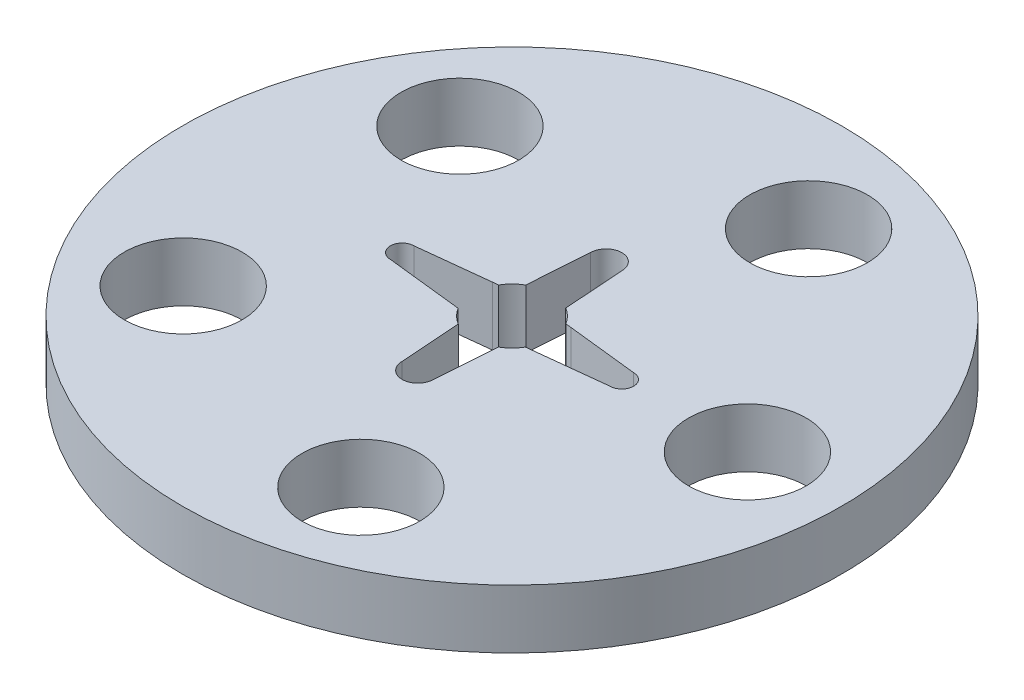
ISO-10303-21;
HEADER;
FILE_DESCRIPTION(('STEP AP214'),'2;1');
FILE_NAME('part.step','',(''),(''),'','','');
FILE_SCHEMA(('AUTOMOTIVE_DESIGN { 1 0 10303 214 1 1 1 1 }'));
ENDSEC;
DATA;
#1=APPLICATION_CONTEXT('core data for automotive mechanical design processes');
#2=APPLICATION_PROTOCOL_DEFINITION('international standard','automotive_design',2000,#1);
#3=PRODUCT_CONTEXT('',#1,'mechanical');
#4=PRODUCT('Part','Part','',(#3));
#5=PRODUCT_RELATED_PRODUCT_CATEGORY('part','',(#4));
#6=PRODUCT_DEFINITION_FORMATION('','',#4);
#7=PRODUCT_DEFINITION_CONTEXT('part definition',#1,'design');
#8=PRODUCT_DEFINITION('design','',#6,#7);
#9=PRODUCT_DEFINITION_SHAPE('','',#8);
#10=(LENGTH_UNIT() NAMED_UNIT(*) SI_UNIT(.MILLI.,.METRE.));
#11=(NAMED_UNIT(*) PLANE_ANGLE_UNIT() SI_UNIT($,.RADIAN.));
#12=(NAMED_UNIT(*) SI_UNIT($,.STERADIAN.) SOLID_ANGLE_UNIT());
#13=UNCERTAINTY_MEASURE_WITH_UNIT(LENGTH_MEASURE(1.E-05),#10,'distance_accuracy_value','');
#14=(GEOMETRIC_REPRESENTATION_CONTEXT(3) GLOBAL_UNCERTAINTY_ASSIGNED_CONTEXT((#13)) GLOBAL_UNIT_ASSIGNED_CONTEXT((#10,
#11,#12)) REPRESENTATION_CONTEXT('',''));
#15=CARTESIAN_POINT('',(0.,0.,0.));
#16=DIRECTION('',(0.,0.,1.));
#17=DIRECTION('',(1.,0.,0.));
#18=AXIS2_PLACEMENT_3D('',#15,#16,#17);
#19=CARTESIAN_POINT('',(0.,7.5,0.));
#20=DIRECTION('',(0.,1.,0.));
#21=DIRECTION('',(0.,0.,1.));
#22=AXIS2_PLACEMENT_3D('',#19,#20,#21);
#23=PLANE('',#22);
#24=CARTESIAN_POINT('',(-24.2705098312485,7.5,-17.6335575687741));
#25=DIRECTION('',(0.,1.,0.));
#26=DIRECTION('',(0.,0.,1.));
#27=AXIS2_PLACEMENT_3D('',#24,#25,#26);
#28=CIRCLE('',#27,7.5);
#29=CARTESIAN_POINT('',(-24.2705098312485,7.5,-10.1335575687741));
#30=VERTEX_POINT('',#29);
#31=EDGE_CURVE('E352',#30,#30,#28,.T.);
#32=ORIENTED_EDGE('',*,*,#31,.F.);
#33=EDGE_LOOP('',(#32));
#34=FACE_BOUND('',#33,.T.);
#35=CARTESIAN_POINT('',(9.27050983124848,7.5,28.5316954888547));
#36=DIRECTION('',(0.,1.,0.));
#37=DIRECTION('',(0.,0.,1.));
#38=AXIS2_PLACEMENT_3D('',#35,#36,#37);
#39=CIRCLE('',#38,7.5);
#40=CARTESIAN_POINT('',(9.27050983124848,7.5,36.0316954888547));
#41=VERTEX_POINT('',#40);
#42=EDGE_CURVE('E364',#41,#41,#39,.T.);
#43=ORIENTED_EDGE('',*,*,#42,.F.);
#44=EDGE_LOOP('',(#43));
#45=FACE_BOUND('',#44,.T.);
#46=CARTESIAN_POINT('',(0.,7.5,0.));
#47=DIRECTION('',(0.,1.,0.));
#48=DIRECTION('',(0.,0.,1.));
#49=AXIS2_PLACEMENT_3D('',#46,#47,#48);
#50=CIRCLE('',#49,42.);
#51=CARTESIAN_POINT('',(0.,7.5,42.));
#52=VERTEX_POINT('',#51);
#53=EDGE_CURVE('E11',#52,#52,#50,.T.);
#54=ORIENTED_EDGE('',*,*,#53,.T.);
#55=EDGE_LOOP('',(#54));
#56=FACE_BOUND('',#55,.T.);
#57=CARTESIAN_POINT('',(30.,7.5,0.));
#58=DIRECTION('',(0.,1.,0.));
#59=DIRECTION('',(0.,0.,1.));
#60=AXIS2_PLACEMENT_3D('',#57,#58,#59);
#61=CIRCLE('',#60,7.5);
#62=CARTESIAN_POINT('',(30.,7.5,7.5));
#63=VERTEX_POINT('',#62);
#64=EDGE_CURVE('E370',#63,#63,#61,.T.);
#65=ORIENTED_EDGE('',*,*,#64,.F.);
#66=EDGE_LOOP('',(#65));
#67=FACE_BOUND('',#66,.T.);
#68=CARTESIAN_POINT('',(-24.2705098312484,7.5,17.6335575687743));
#69=DIRECTION('',(0.,1.,0.));
#70=DIRECTION('',(0.,0.,1.));
#71=AXIS2_PLACEMENT_3D('',#68,#69,#70);
#72=CIRCLE('',#71,7.5);
#73=CARTESIAN_POINT('',(-24.2705098312484,7.5,25.1335575687743));
#74=VERTEX_POINT('',#73);
#75=EDGE_CURVE('E358',#74,#74,#72,.T.);
#76=ORIENTED_EDGE('',*,*,#75,.F.);
#77=EDGE_LOOP('',(#76));
#78=FACE_BOUND('',#77,.T.);
#79=CARTESIAN_POINT('',(9.27050983124836,7.5,-28.5316954888546));
#80=DIRECTION('',(0.,1.,0.));
#81=DIRECTION('',(0.,0.,1.));
#82=AXIS2_PLACEMENT_3D('',#79,#80,#81);
#83=CIRCLE('',#82,7.5);
#84=CARTESIAN_POINT('',(9.27050983124836,7.5,-21.0316954888546));
#85=VERTEX_POINT('',#84);
#86=EDGE_CURVE('E346',#85,#85,#83,.T.);
#87=ORIENTED_EDGE('',*,*,#86,.F.);
#88=EDGE_LOOP('',(#87));
#89=FACE_BOUND('',#88,.T.);
#90=DIRECTION('',(0.0708965575536933,0.,-0.997483673113017));
#91=VECTOR('',#90,1.);
#92=CARTESIAN_POINT('',(2.,7.5,12.));
#93=LINE('',#92,#91);
#94=CARTESIAN_POINT('',(2.,7.5,12.));
#95=VERTEX_POINT('',#94);
#96=CARTESIAN_POINT('',(2.49752798628677,7.5,4.99999802018599));
#97=VERTEX_POINT('',#96);
#98=EDGE_CURVE('E190',#95,#97,#93,.T.);
#99=ORIENTED_EDGE('',*,*,#98,.F.);
#100=CARTESIAN_POINT('',(0.,7.5,12.));
#101=DIRECTION('',(0.,1.,0.));
#102=DIRECTION('',(0.,0.,-1.));
#103=AXIS2_PLACEMENT_3D('',#100,#101,#102);
#104=CIRCLE('',#103,2.);
#105=CARTESIAN_POINT('',(-2.,7.5,12.));
#106=VERTEX_POINT('',#105);
#107=EDGE_CURVE('E182',#106,#95,#104,.T.);
#108=ORIENTED_EDGE('',*,*,#107,.F.);
#109=DIRECTION('',(0.0708190445228668,0.,0.997489179356282));
#110=VECTOR('',#109,1.);
#111=CARTESIAN_POINT('',(-2.49698128273283,7.5,4.99999802018599));
#112=LINE('',#111,#110);
#113=CARTESIAN_POINT('',(-2.54649480640618,7.5,4.30259798565124));
#114=VERTEX_POINT('',#113);
#115=EDGE_CURVE('E243',#114,#106,#112,.T.);
#116=ORIENTED_EDGE('',*,*,#115,.F.);
#117=CARTESIAN_POINT('',(0.,7.5,0.));
#118=DIRECTION('',(0.,1.,0.));
#119=DIRECTION('',(0.,0.,1.));
#120=AXIS2_PLACEMENT_3D('',#117,#118,#119);
#121=CIRCLE('',#120,4.99969851342896);
#122=CARTESIAN_POINT('',(-4.28517241592771,7.5,2.57571011392121));
#123=VERTEX_POINT('',#122);
#124=EDGE_CURVE('E241',#123,#114,#121,.T.);
#125=ORIENTED_EDGE('',*,*,#124,.F.);
#126=DIRECTION('',(0.99402586608719,0.,0.109144755025657));
#127=VECTOR('',#126,1.);
#128=CARTESIAN_POINT('',(-4.99969851342896,7.5,2.4972546345098));
#129=LINE('',#128,#127);
#130=CARTESIAN_POINT('',(-4.99969851342896,7.5,2.4972546345098));
#131=VERTEX_POINT('',#130);
#132=EDGE_CURVE('E239',#131,#123,#129,.T.);
#133=ORIENTED_EDGE('',*,*,#132,.F.);
#134=DIRECTION('',(0.993917369771732,0.,0.110128389010475));
#135=VECTOR('',#134,1.);
#136=CARTESIAN_POINT('',(-14.,7.5,1.5));
#137=LINE('',#136,#135);
#138=CARTESIAN_POINT('',(-14.,7.5,1.5));
#139=VERTEX_POINT('',#138);
#140=EDGE_CURVE('E237',#139,#131,#137,.T.);
#141=ORIENTED_EDGE('',*,*,#140,.F.);
#142=CARTESIAN_POINT('',(-14.,7.5,0.));
#143=DIRECTION('',(0.,1.,0.));
#144=DIRECTION('',(0.,0.,1.));
#145=AXIS2_PLACEMENT_3D('',#142,#143,#144);
#146=CIRCLE('',#145,1.5);
#147=CARTESIAN_POINT('',(-14.,7.5,-1.5));
#148=VERTEX_POINT('',#147);
#149=EDGE_CURVE('E235',#148,#139,#146,.T.);
#150=ORIENTED_EDGE('',*,*,#149,.F.);
#151=DIRECTION('',(-0.993917369771732,0.,0.110128389010475));
#152=VECTOR('',#151,1.);
#153=CARTESIAN_POINT('',(-14.,7.5,-1.5));
#154=LINE('',#153,#152);
#155=CARTESIAN_POINT('',(-4.99969851342896,7.5,-2.4972546345098));
#156=VERTEX_POINT('',#155);
#157=EDGE_CURVE('E233',#156,#148,#154,.T.);
#158=ORIENTED_EDGE('',*,*,#157,.F.);
#159=DIRECTION('',(-0.99402586608719,0.,0.109144755025657));
#160=VECTOR('',#159,1.);
#161=CARTESIAN_POINT('',(-4.99969851342896,7.5,-2.4972546345098));
#162=LINE('',#161,#160);
#163=CARTESIAN_POINT('',(-4.28517241592771,7.5,-2.57571011392121));
#164=VERTEX_POINT('',#163);
#165=EDGE_CURVE('E231',#164,#156,#162,.T.);
#166=ORIENTED_EDGE('',*,*,#165,.F.);
#167=CARTESIAN_POINT('',(0.,7.5,0.));
#168=DIRECTION('',(0.,1.,0.));
#169=DIRECTION('',(0.,0.,1.));
#170=AXIS2_PLACEMENT_3D('',#167,#168,#169);
#171=CIRCLE('',#170,4.99969851342896);
#172=CARTESIAN_POINT('',(-2.54649480640618,7.5,-4.30259798565124));
#173=VERTEX_POINT('',#172);
#174=EDGE_CURVE('E229',#173,#164,#171,.T.);
#175=ORIENTED_EDGE('',*,*,#174,.F.);
#176=DIRECTION('',(-0.0708190445228667,0.,0.997489179356282));
#177=VECTOR('',#176,1.);
#178=CARTESIAN_POINT('',(-2.,7.5,-12.));
#179=LINE('',#178,#177);
#180=CARTESIAN_POINT('',(-2.,7.5,-12.));
#181=VERTEX_POINT('',#180);
#182=EDGE_CURVE('E227',#181,#173,#179,.T.);
#183=ORIENTED_EDGE('',*,*,#182,.F.);
#184=CARTESIAN_POINT('',(0.,7.5,-12.));
#185=DIRECTION('',(0.,1.,0.));
#186=DIRECTION('',(0.,0.,1.));
#187=AXIS2_PLACEMENT_3D('',#184,#185,#186);
#188=CIRCLE('',#187,2.);
#189=CARTESIAN_POINT('',(2.,7.5,-12.));
#190=VERTEX_POINT('',#189);
#191=EDGE_CURVE('E225',#190,#181,#188,.T.);
#192=ORIENTED_EDGE('',*,*,#191,.F.);
#193=DIRECTION('',(-0.0708965575536933,0.,-0.997483673113017));
#194=VECTOR('',#193,1.);
#195=CARTESIAN_POINT('',(2.,7.5,-12.));
#196=LINE('',#195,#194);
#197=CARTESIAN_POINT('',(2.49752798628677,7.5,-4.99999802018599));
#198=VERTEX_POINT('',#197);
#199=EDGE_CURVE('E223',#198,#190,#196,.T.);
#200=ORIENTED_EDGE('',*,*,#199,.F.);
#201=DIRECTION('',(-0.0701953019469326,0.,-0.997533267407448));
#202=VECTOR('',#201,1.);
#203=CARTESIAN_POINT('',(2.49752798628677,7.5,-4.99999802018599));
#204=LINE('',#203,#202);
#205=CARTESIAN_POINT('',(2.54660796060753,7.5,-4.30253101327046));
#206=VERTEX_POINT('',#205);
#207=EDGE_CURVE('E221',#206,#198,#204,.T.);
#208=ORIENTED_EDGE('',*,*,#207,.F.);
#209=CARTESIAN_POINT('',(0.,7.5,0.));
#210=DIRECTION('',(0.,1.,0.));
#211=DIRECTION('',(0.,0.,1.));
#212=AXIS2_PLACEMENT_3D('',#209,#210,#211);
#213=CIRCLE('',#212,4.99969851342896);
#214=CARTESIAN_POINT('',(4.28517241592771,7.5,-2.57571011392121));
#215=VERTEX_POINT('',#214);
#216=EDGE_CURVE('E219',#215,#206,#213,.T.);
#217=ORIENTED_EDGE('',*,*,#216,.F.);
#218=DIRECTION('',(-0.99402586608719,0.,-0.109144755025657));
#219=VECTOR('',#218,1.);
#220=CARTESIAN_POINT('',(4.99969851342896,7.5,-2.4972546345098));
#221=LINE('',#220,#219);
#222=CARTESIAN_POINT('',(4.99969851342896,7.5,-2.4972546345098));
#223=VERTEX_POINT('',#222);
#224=EDGE_CURVE('E217',#223,#215,#221,.T.);
#225=ORIENTED_EDGE('',*,*,#224,.F.);
#226=DIRECTION('',(-0.993917369771732,0.,-0.110128389010475));
#227=VECTOR('',#226,1.);
#228=CARTESIAN_POINT('',(14.,7.5,-1.5));
#229=LINE('',#228,#227);
#230=CARTESIAN_POINT('',(14.,7.5,-1.5));
#231=VERTEX_POINT('',#230);
#232=EDGE_CURVE('E215',#231,#223,#229,.T.);
#233=ORIENTED_EDGE('',*,*,#232,.F.);
#234=CARTESIAN_POINT('',(14.,7.5,0.));
#235=DIRECTION('',(0.,1.,0.));
#236=DIRECTION('',(0.,0.,-1.));
#237=AXIS2_PLACEMENT_3D('',#234,#235,#236);
#238=CIRCLE('',#237,1.5);
#239=CARTESIAN_POINT('',(14.,7.5,1.5));
#240=VERTEX_POINT('',#239);
#241=EDGE_CURVE('E213',#240,#231,#238,.T.);
#242=ORIENTED_EDGE('',*,*,#241,.F.);
#243=DIRECTION('',(0.993917369771732,0.,-0.110128389010475));
#244=VECTOR('',#243,1.);
#245=CARTESIAN_POINT('',(14.,7.5,1.5));
#246=LINE('',#245,#244);
#247=CARTESIAN_POINT('',(4.99969851342896,7.5,2.4972546345098));
#248=VERTEX_POINT('',#247);
#249=EDGE_CURVE('E211',#248,#240,#246,.T.);
#250=ORIENTED_EDGE('',*,*,#249,.F.);
#251=DIRECTION('',(0.99402586608719,0.,-0.109144755025657));
#252=VECTOR('',#251,1.);
#253=CARTESIAN_POINT('',(4.99969851342896,7.5,2.4972546345098));
#254=LINE('',#253,#252);
#255=CARTESIAN_POINT('',(4.28517241592771,7.5,2.57571011392121));
#256=VERTEX_POINT('',#255);
#257=EDGE_CURVE('E209',#256,#248,#254,.T.);
#258=ORIENTED_EDGE('',*,*,#257,.F.);
#259=CARTESIAN_POINT('',(0.,7.5,0.));
#260=DIRECTION('',(0.,1.,0.));
#261=DIRECTION('',(0.,0.,1.));
#262=AXIS2_PLACEMENT_3D('',#259,#260,#261);
#263=CIRCLE('',#262,4.99969851342896);
#264=CARTESIAN_POINT('',(2.54660796060753,7.5,4.30253101327046));
#265=VERTEX_POINT('',#264);
#266=EDGE_CURVE('E205',#265,#256,#263,.T.);
#267=ORIENTED_EDGE('',*,*,#266,.F.);
#268=DIRECTION('',(0.0701953019469326,0.,-0.997533267407448));
#269=VECTOR('',#268,1.);
#270=CARTESIAN_POINT('',(2.49752798628677,7.5,4.99999802018599));
#271=LINE('',#270,#269);
#272=EDGE_CURVE('E203',#97,#265,#271,.T.);
#273=ORIENTED_EDGE('',*,*,#272,.F.);
#274=EDGE_LOOP('',(#99,#108,#116,#125,#133,#141,#150,#158,#166,#175,#183,#192,#200,#208,#217,
#225,#233,#242,#250,#258,#267,#273));
#275=FACE_BOUND('',#274,.T.);
#276=ADVANCED_FACE('F33',(#34,#45,#56,#67,#78,#89,#275),#23,.T.);
#277=CARTESIAN_POINT('',(0.,0.,0.));
#278=DIRECTION('',(0.,1.,0.));
#279=DIRECTION('',(0.,0.,1.));
#280=AXIS2_PLACEMENT_3D('',#277,#278,#279);
#281=PLANE('',#280);
#282=CARTESIAN_POINT('',(9.27050983124836,0.,-28.5316954888546));
#283=DIRECTION('',(0.,1.,0.));
#284=DIRECTION('',(0.,0.,1.));
#285=AXIS2_PLACEMENT_3D('',#282,#283,#284);
#286=CIRCLE('',#285,7.5);
#287=CARTESIAN_POINT('',(9.27050983124836,0.,-21.0316954888546));
#288=VERTEX_POINT('',#287);
#289=EDGE_CURVE('E198',#288,#288,#286,.T.);
#290=ORIENTED_EDGE('',*,*,#289,.T.);
#291=EDGE_LOOP('',(#290));
#292=FACE_BOUND('',#291,.T.);
#293=CARTESIAN_POINT('',(-24.2705098312485,0.,-17.6335575687741));
#294=DIRECTION('',(0.,1.,0.));
#295=DIRECTION('',(0.,0.,1.));
#296=AXIS2_PLACEMENT_3D('',#293,#294,#295);
#297=CIRCLE('',#296,7.5);
#298=CARTESIAN_POINT('',(-24.2705098312485,0.,-10.1335575687741));
#299=VERTEX_POINT('',#298);
#300=EDGE_CURVE('E349',#299,#299,#297,.T.);
#301=ORIENTED_EDGE('',*,*,#300,.T.);
#302=EDGE_LOOP('',(#301));
#303=FACE_BOUND('',#302,.T.);
#304=CARTESIAN_POINT('',(-24.2705098312484,0.,17.6335575687743));
#305=DIRECTION('',(0.,1.,0.));
#306=DIRECTION('',(0.,0.,1.));
#307=AXIS2_PLACEMENT_3D('',#304,#305,#306);
#308=CIRCLE('',#307,7.5);
#309=CARTESIAN_POINT('',(-24.2705098312484,0.,25.1335575687743));
#310=VERTEX_POINT('',#309);
#311=EDGE_CURVE('E355',#310,#310,#308,.T.);
#312=ORIENTED_EDGE('',*,*,#311,.T.);
#313=EDGE_LOOP('',(#312));
#314=FACE_BOUND('',#313,.T.);
#315=CARTESIAN_POINT('',(9.27050983124848,0.,28.5316954888547));
#316=DIRECTION('',(0.,1.,0.));
#317=DIRECTION('',(0.,0.,1.));
#318=AXIS2_PLACEMENT_3D('',#315,#316,#317);
#319=CIRCLE('',#318,7.5);
#320=CARTESIAN_POINT('',(9.27050983124848,0.,36.0316954888547));
#321=VERTEX_POINT('',#320);
#322=EDGE_CURVE('E361',#321,#321,#319,.T.);
#323=ORIENTED_EDGE('',*,*,#322,.T.);
#324=EDGE_LOOP('',(#323));
#325=FACE_BOUND('',#324,.T.);
#326=CARTESIAN_POINT('',(30.,0.,0.));
#327=DIRECTION('',(0.,1.,0.));
#328=DIRECTION('',(0.,0.,1.));
#329=AXIS2_PLACEMENT_3D('',#326,#327,#328);
#330=CIRCLE('',#329,7.5);
#331=CARTESIAN_POINT('',(30.,0.,7.5));
#332=VERTEX_POINT('',#331);
#333=EDGE_CURVE('E367',#332,#332,#330,.T.);
#334=ORIENTED_EDGE('',*,*,#333,.T.);
#335=EDGE_LOOP('',(#334));
#336=FACE_BOUND('',#335,.T.);
#337=CARTESIAN_POINT('',(0.,0.,0.));
#338=DIRECTION('',(0.,1.,0.));
#339=DIRECTION('',(0.,0.,1.));
#340=AXIS2_PLACEMENT_3D('',#337,#338,#339);
#341=CIRCLE('',#340,42.);
#342=CARTESIAN_POINT('',(0.,0.,42.));
#343=VERTEX_POINT('',#342);
#344=EDGE_CURVE('E37',#343,#343,#341,.T.);
#345=ORIENTED_EDGE('',*,*,#344,.F.);
#346=EDGE_LOOP('',(#345));
#347=FACE_BOUND('',#346,.T.);
#348=CARTESIAN_POINT('',(0.,0.,12.));
#349=DIRECTION('',(0.,1.,0.));
#350=DIRECTION('',(0.,0.,-1.));
#351=AXIS2_PLACEMENT_3D('',#348,#349,#350);
#352=CIRCLE('',#351,2.);
#353=CARTESIAN_POINT('',(-2.,0.,12.));
#354=VERTEX_POINT('',#353);
#355=CARTESIAN_POINT('',(2.,0.,12.));
#356=VERTEX_POINT('',#355);
#357=EDGE_CURVE('E56',#354,#356,#352,.T.);
#358=ORIENTED_EDGE('',*,*,#357,.T.);
#359=DIRECTION('',(0.0708965575536933,0.,-0.997483673113017));
#360=VECTOR('',#359,1.);
#361=CARTESIAN_POINT('',(2.,0.,12.));
#362=LINE('',#361,#360);
#363=CARTESIAN_POINT('',(2.49752798628677,0.,4.99999802018599));
#364=VERTEX_POINT('',#363);
#365=EDGE_CURVE('E197',#356,#364,#362,.T.);
#366=ORIENTED_EDGE('',*,*,#365,.T.);
#367=DIRECTION('',(0.0701953019469326,0.,-0.997533267407448));
#368=VECTOR('',#367,1.);
#369=CARTESIAN_POINT('',(2.49752798628677,0.,4.99999802018599));
#370=LINE('',#369,#368);
#371=CARTESIAN_POINT('',(2.54660796060753,0.,4.30253101327046));
#372=VERTEX_POINT('',#371);
#373=EDGE_CURVE('E247',#364,#372,#370,.T.);
#374=ORIENTED_EDGE('',*,*,#373,.T.);
#375=CARTESIAN_POINT('',(0.,0.,0.));
#376=DIRECTION('',(0.,1.,0.));
#377=DIRECTION('',(0.,0.,1.));
#378=AXIS2_PLACEMENT_3D('',#375,#376,#377);
#379=CIRCLE('',#378,4.99969851342896);
#380=CARTESIAN_POINT('',(4.28517241592771,0.,2.57571011392121));
#381=VERTEX_POINT('',#380);
#382=EDGE_CURVE('E250',#372,#381,#379,.T.);
#383=ORIENTED_EDGE('',*,*,#382,.T.);
#384=DIRECTION('',(0.99402586608719,0.,-0.109144755025657));
#385=VECTOR('',#384,1.);
#386=CARTESIAN_POINT('',(4.99969851342896,0.,2.4972546345098));
#387=LINE('',#386,#385);
#388=CARTESIAN_POINT('',(4.99969851342896,0.,2.4972546345098));
#389=VERTEX_POINT('',#388);
#390=EDGE_CURVE('E253',#381,#389,#387,.T.);
#391=ORIENTED_EDGE('',*,*,#390,.T.);
#392=DIRECTION('',(0.993917369771732,0.,-0.110128389010475));
#393=VECTOR('',#392,1.);
#394=CARTESIAN_POINT('',(14.,0.,1.5));
#395=LINE('',#394,#393);
#396=CARTESIAN_POINT('',(14.,0.,1.5));
#397=VERTEX_POINT('',#396);
#398=EDGE_CURVE('E256',#389,#397,#395,.T.);
#399=ORIENTED_EDGE('',*,*,#398,.T.);
#400=CARTESIAN_POINT('',(14.,0.,0.));
#401=DIRECTION('',(0.,1.,0.));
#402=DIRECTION('',(0.,0.,-1.));
#403=AXIS2_PLACEMENT_3D('',#400,#401,#402);
#404=CIRCLE('',#403,1.5);
#405=CARTESIAN_POINT('',(14.,0.,-1.5));
#406=VERTEX_POINT('',#405);
#407=EDGE_CURVE('E259',#397,#406,#404,.T.);
#408=ORIENTED_EDGE('',*,*,#407,.T.);
#409=DIRECTION('',(-0.993917369771732,0.,-0.110128389010475));
#410=VECTOR('',#409,1.);
#411=CARTESIAN_POINT('',(14.,0.,-1.5));
#412=LINE('',#411,#410);
#413=CARTESIAN_POINT('',(4.99969851342896,0.,-2.4972546345098));
#414=VERTEX_POINT('',#413);
#415=EDGE_CURVE('E262',#406,#414,#412,.T.);
#416=ORIENTED_EDGE('',*,*,#415,.T.);
#417=DIRECTION('',(-0.99402586608719,0.,-0.109144755025657));
#418=VECTOR('',#417,1.);
#419=CARTESIAN_POINT('',(4.99969851342896,0.,-2.4972546345098));
#420=LINE('',#419,#418);
#421=CARTESIAN_POINT('',(4.28517241592771,0.,-2.57571011392121));
#422=VERTEX_POINT('',#421);
#423=EDGE_CURVE('E265',#414,#422,#420,.T.);
#424=ORIENTED_EDGE('',*,*,#423,.T.);
#425=CARTESIAN_POINT('',(0.,0.,0.));
#426=DIRECTION('',(0.,1.,0.));
#427=DIRECTION('',(0.,0.,1.));
#428=AXIS2_PLACEMENT_3D('',#425,#426,#427);
#429=CIRCLE('',#428,4.99969851342896);
#430=CARTESIAN_POINT('',(2.54660796060753,0.,-4.30253101327046));
#431=VERTEX_POINT('',#430);
#432=EDGE_CURVE('E268',#422,#431,#429,.T.);
#433=ORIENTED_EDGE('',*,*,#432,.T.);
#434=DIRECTION('',(-0.0701953019469326,0.,-0.997533267407448));
#435=VECTOR('',#434,1.);
#436=CARTESIAN_POINT('',(2.49752798628677,0.,-4.99999802018599));
#437=LINE('',#436,#435);
#438=CARTESIAN_POINT('',(2.49752798628677,0.,-4.99999802018599));
#439=VERTEX_POINT('',#438);
#440=EDGE_CURVE('E271',#431,#439,#437,.T.);
#441=ORIENTED_EDGE('',*,*,#440,.T.);
#442=DIRECTION('',(-0.0708965575536933,0.,-0.997483673113017));
#443=VECTOR('',#442,1.);
#444=CARTESIAN_POINT('',(2.,0.,-12.));
#445=LINE('',#444,#443);
#446=CARTESIAN_POINT('',(2.,0.,-12.));
#447=VERTEX_POINT('',#446);
#448=EDGE_CURVE('E274',#439,#447,#445,.T.);
#449=ORIENTED_EDGE('',*,*,#448,.T.);
#450=CARTESIAN_POINT('',(0.,0.,-12.));
#451=DIRECTION('',(0.,1.,0.));
#452=DIRECTION('',(0.,0.,1.));
#453=AXIS2_PLACEMENT_3D('',#450,#451,#452);
#454=CIRCLE('',#453,2.);
#455=CARTESIAN_POINT('',(-2.,0.,-12.));
#456=VERTEX_POINT('',#455);
#457=EDGE_CURVE('E277',#447,#456,#454,.T.);
#458=ORIENTED_EDGE('',*,*,#457,.T.);
#459=DIRECTION('',(-0.070819044522865,0.,0.997489179356282));
#460=VECTOR('',#459,1.);
#461=CARTESIAN_POINT('',(-2.49698128273283,0.,-4.99999802018599));
#462=LINE('',#461,#460);
#463=CARTESIAN_POINT('',(-2.54649480640618,0.,-4.30259798565124));
#464=VERTEX_POINT('',#463);
#465=EDGE_CURVE('E280',#456,#464,#462,.T.);
#466=ORIENTED_EDGE('',*,*,#465,.T.);
#467=CARTESIAN_POINT('',(0.,0.,0.));
#468=DIRECTION('',(0.,1.,0.));
#469=DIRECTION('',(0.,0.,1.));
#470=AXIS2_PLACEMENT_3D('',#467,#468,#469);
#471=CIRCLE('',#470,4.99969851342896);
#472=CARTESIAN_POINT('',(-4.28517241592771,0.,-2.57571011392121));
#473=VERTEX_POINT('',#472);
#474=EDGE_CURVE('E283',#464,#473,#471,.T.);
#475=ORIENTED_EDGE('',*,*,#474,.T.);
#476=DIRECTION('',(-0.99402586608719,0.,0.109144755025657));
#477=VECTOR('',#476,1.);
#478=CARTESIAN_POINT('',(-4.99969851342896,0.,-2.4972546345098));
#479=LINE('',#478,#477);
#480=CARTESIAN_POINT('',(-4.99969851342896,0.,-2.4972546345098));
#481=VERTEX_POINT('',#480);
#482=EDGE_CURVE('E286',#473,#481,#479,.T.);
#483=ORIENTED_EDGE('',*,*,#482,.T.);
#484=DIRECTION('',(-0.993917369771732,0.,0.110128389010475));
#485=VECTOR('',#484,1.);
#486=CARTESIAN_POINT('',(-14.,0.,-1.5));
#487=LINE('',#486,#485);
#488=CARTESIAN_POINT('',(-14.,0.,-1.5));
#489=VERTEX_POINT('',#488);
#490=EDGE_CURVE('E289',#481,#489,#487,.T.);
#491=ORIENTED_EDGE('',*,*,#490,.T.);
#492=CARTESIAN_POINT('',(-14.,0.,0.));
#493=DIRECTION('',(0.,1.,0.));
#494=DIRECTION('',(0.,0.,1.));
#495=AXIS2_PLACEMENT_3D('',#492,#493,#494);
#496=CIRCLE('',#495,1.5);
#497=CARTESIAN_POINT('',(-14.,0.,1.5));
#498=VERTEX_POINT('',#497);
#499=EDGE_CURVE('E292',#489,#498,#496,.T.);
#500=ORIENTED_EDGE('',*,*,#499,.T.);
#501=DIRECTION('',(0.993917369771732,0.,0.110128389010475));
#502=VECTOR('',#501,1.);
#503=CARTESIAN_POINT('',(-14.,0.,1.5));
#504=LINE('',#503,#502);
#505=CARTESIAN_POINT('',(-4.99969851342896,0.,2.4972546345098));
#506=VERTEX_POINT('',#505);
#507=EDGE_CURVE('E295',#498,#506,#504,.T.);
#508=ORIENTED_EDGE('',*,*,#507,.T.);
#509=DIRECTION('',(0.99402586608719,0.,0.109144755025657));
#510=VECTOR('',#509,1.);
#511=CARTESIAN_POINT('',(-4.99969851342896,0.,2.4972546345098));
#512=LINE('',#511,#510);
#513=CARTESIAN_POINT('',(-4.28517241592771,0.,2.57571011392121));
#514=VERTEX_POINT('',#513);
#515=EDGE_CURVE('E298',#506,#514,#512,.T.);
#516=ORIENTED_EDGE('',*,*,#515,.T.);
#517=CARTESIAN_POINT('',(0.,0.,0.));
#518=DIRECTION('',(0.,1.,0.));
#519=DIRECTION('',(0.,0.,1.));
#520=AXIS2_PLACEMENT_3D('',#517,#518,#519);
#521=CIRCLE('',#520,4.99969851342896);
#522=CARTESIAN_POINT('',(-2.54649480640618,0.,4.30259798565124));
#523=VERTEX_POINT('',#522);
#524=EDGE_CURVE('E301',#514,#523,#521,.T.);
#525=ORIENTED_EDGE('',*,*,#524,.T.);
#526=DIRECTION('',(0.0708190445228665,0.,0.997489179356282));
#527=VECTOR('',#526,1.);
#528=CARTESIAN_POINT('',(-2.,0.,12.));
#529=LINE('',#528,#527);
#530=EDGE_CURVE('E191',#523,#354,#529,.T.);
#531=ORIENTED_EDGE('',*,*,#530,.T.);
#532=EDGE_LOOP('',(#358,#366,#374,#383,#391,#399,#408,#416,#424,#433,#441,#449,#458,#466,#475,
#483,#491,#500,#508,#516,#525,#531));
#533=FACE_BOUND('',#532,.T.);
#534=ADVANCED_FACE('F376',(#292,#303,#314,#325,#336,#347,#533),#281,.F.);
#535=CARTESIAN_POINT('',(0.,7.5,0.));
#536=DIRECTION('',(0.,-1.,0.));
#537=DIRECTION('',(0.,0.,-1.));
#538=AXIS2_PLACEMENT_3D('',#535,#536,#537);
#539=CYLINDRICAL_SURFACE('',#538,42.);
#540=ORIENTED_EDGE('',*,*,#53,.F.);
#541=EDGE_LOOP('',(#540));
#542=FACE_BOUND('',#541,.T.);
#543=ORIENTED_EDGE('',*,*,#344,.T.);
#544=EDGE_LOOP('',(#543));
#545=FACE_BOUND('',#544,.T.);
#546=ADVANCED_FACE('F35',(#542,#545),#539,.T.);
#547=CARTESIAN_POINT('',(30.,7.5,0.));
#548=DIRECTION('',(0.,-1.,0.));
#549=DIRECTION('',(0.,0.,-1.));
#550=AXIS2_PLACEMENT_3D('',#547,#548,#549);
#551=CYLINDRICAL_SURFACE('',#550,7.5);
#552=ORIENTED_EDGE('',*,*,#64,.T.);
#553=EDGE_LOOP('',(#552));
#554=FACE_BOUND('',#553,.T.);
#555=ORIENTED_EDGE('',*,*,#333,.F.);
#556=EDGE_LOOP('',(#555));
#557=FACE_BOUND('',#556,.T.);
#558=ADVANCED_FACE('F379',(#554,#557),#551,.F.);
#559=CARTESIAN_POINT('',(9.27050983124848,7.5,28.5316954888547));
#560=DIRECTION('',(0.,-1.,0.));
#561=DIRECTION('',(0.,0.,-1.));
#562=AXIS2_PLACEMENT_3D('',#559,#560,#561);
#563=CYLINDRICAL_SURFACE('',#562,7.5);
#564=ORIENTED_EDGE('',*,*,#42,.T.);
#565=EDGE_LOOP('',(#564));
#566=FACE_BOUND('',#565,.T.);
#567=ORIENTED_EDGE('',*,*,#322,.F.);
#568=EDGE_LOOP('',(#567));
#569=FACE_BOUND('',#568,.T.);
#570=ADVANCED_FACE('F381',(#566,#569),#563,.F.);
#571=CARTESIAN_POINT('',(-24.2705098312484,7.5,17.6335575687743));
#572=DIRECTION('',(0.,-1.,0.));
#573=DIRECTION('',(0.,0.,-1.));
#574=AXIS2_PLACEMENT_3D('',#571,#572,#573);
#575=CYLINDRICAL_SURFACE('',#574,7.5);
#576=ORIENTED_EDGE('',*,*,#75,.T.);
#577=EDGE_LOOP('',(#576));
#578=FACE_BOUND('',#577,.T.);
#579=ORIENTED_EDGE('',*,*,#311,.F.);
#580=EDGE_LOOP('',(#579));
#581=FACE_BOUND('',#580,.T.);
#582=ADVANCED_FACE('F388',(#578,#581),#575,.F.);
#583=CARTESIAN_POINT('',(-24.2705098312485,7.5,-17.6335575687741));
#584=DIRECTION('',(0.,-1.,0.));
#585=DIRECTION('',(0.,0.,-1.));
#586=AXIS2_PLACEMENT_3D('',#583,#584,#585);
#587=CYLINDRICAL_SURFACE('',#586,7.5);
#588=ORIENTED_EDGE('',*,*,#31,.T.);
#589=EDGE_LOOP('',(#588));
#590=FACE_BOUND('',#589,.T.);
#591=ORIENTED_EDGE('',*,*,#300,.F.);
#592=EDGE_LOOP('',(#591));
#593=FACE_BOUND('',#592,.T.);
#594=ADVANCED_FACE('F414',(#590,#593),#587,.F.);
#595=CARTESIAN_POINT('',(9.27050983124836,7.5,-28.5316954888546));
#596=DIRECTION('',(0.,-1.,0.));
#597=DIRECTION('',(0.,0.,-1.));
#598=AXIS2_PLACEMENT_3D('',#595,#596,#597);
#599=CYLINDRICAL_SURFACE('',#598,7.5);
#600=ORIENTED_EDGE('',*,*,#86,.T.);
#601=EDGE_LOOP('',(#600));
#602=FACE_BOUND('',#601,.T.);
#603=ORIENTED_EDGE('',*,*,#289,.F.);
#604=EDGE_LOOP('',(#603));
#605=FACE_BOUND('',#604,.T.);
#606=ADVANCED_FACE('F411',(#602,#605),#599,.F.);
#607=CARTESIAN_POINT('',(0.,7.5,12.));
#608=DIRECTION('',(0.,-1.,0.));
#609=DIRECTION('',(0.,0.,-1.));
#610=AXIS2_PLACEMENT_3D('',#607,#608,#609);
#611=CYLINDRICAL_SURFACE('',#610,2.);
#612=ORIENTED_EDGE('',*,*,#357,.F.);
#613=DIRECTION('',(0.,-1.,0.));
#614=VECTOR('',#613,1.);
#615=CARTESIAN_POINT('',(-2.,7.5,12.));
#616=LINE('',#615,#614);
#617=EDGE_CURVE('E186',#106,#354,#616,.T.);
#618=ORIENTED_EDGE('',*,*,#617,.F.);
#619=ORIENTED_EDGE('',*,*,#107,.T.);
#620=DIRECTION('',(0.,-1.,0.));
#621=VECTOR('',#620,1.);
#622=CARTESIAN_POINT('',(2.,7.5,12.));
#623=LINE('',#622,#621);
#624=EDGE_CURVE('E185',#95,#356,#623,.T.);
#625=ORIENTED_EDGE('',*,*,#624,.T.);
#626=EDGE_LOOP('',(#612,#618,#619,#625));
#627=FACE_BOUND('',#626,.T.);
#628=ADVANCED_FACE('F184',(#627),#611,.F.);
#629=CARTESIAN_POINT('',(2.,7.5,12.));
#630=DIRECTION('',(-0.997483673113017,0.,-0.0708965575536933));
#631=DIRECTION('',(-0.0708965575536933,0.,0.997483673113017));
#632=AXIS2_PLACEMENT_3D('',#629,#630,#631);
#633=PLANE('',#632);
#634=ORIENTED_EDGE('',*,*,#365,.F.);
#635=ORIENTED_EDGE('',*,*,#624,.F.);
#636=ORIENTED_EDGE('',*,*,#98,.T.);
#637=DIRECTION('',(0.,-1.,0.));
#638=VECTOR('',#637,1.);
#639=CARTESIAN_POINT('',(2.49752798628677,7.5,4.99999802018599));
#640=LINE('',#639,#638);
#641=EDGE_CURVE('E199',#97,#364,#640,.T.);
#642=ORIENTED_EDGE('',*,*,#641,.T.);
#643=EDGE_LOOP('',(#634,#635,#636,#642));
#644=FACE_BOUND('',#643,.T.);
#645=ADVANCED_FACE('F194',(#644),#633,.T.);
#646=CARTESIAN_POINT('',(2.49752798628677,7.5,4.99999802018599));
#647=DIRECTION('',(-0.997533267407448,0.,-0.0701953019469326));
#648=DIRECTION('',(-0.0701953019469326,0.,0.997533267407448));
#649=AXIS2_PLACEMENT_3D('',#646,#647,#648);
#650=PLANE('',#649);
#651=ORIENTED_EDGE('',*,*,#373,.F.);
#652=ORIENTED_EDGE('',*,*,#641,.F.);
#653=ORIENTED_EDGE('',*,*,#272,.T.);
#654=DIRECTION('',(0.,-1.,0.));
#655=VECTOR('',#654,1.);
#656=CARTESIAN_POINT('',(2.54660796060753,7.5,4.30253101327046));
#657=LINE('',#656,#655);
#658=EDGE_CURVE('E343',#265,#372,#657,.T.);
#659=ORIENTED_EDGE('',*,*,#658,.T.);
#660=EDGE_LOOP('',(#651,#652,#653,#659));
#661=FACE_BOUND('',#660,.T.);
#662=ADVANCED_FACE('F438',(#661),#650,.T.);
#663=CARTESIAN_POINT('',(0.,7.5,0.));
#664=DIRECTION('',(0.,-1.,0.));
#665=DIRECTION('',(0.,0.,-1.));
#666=AXIS2_PLACEMENT_3D('',#663,#664,#665);
#667=CYLINDRICAL_SURFACE('',#666,4.99969851342896);
#668=ORIENTED_EDGE('',*,*,#382,.F.);
#669=ORIENTED_EDGE('',*,*,#658,.F.);
#670=ORIENTED_EDGE('',*,*,#266,.T.);
#671=DIRECTION('',(0.,-1.,0.));
#672=VECTOR('',#671,1.);
#673=CARTESIAN_POINT('',(4.28517241592771,7.5,2.57571011392121));
#674=LINE('',#673,#672);
#675=EDGE_CURVE('E341',#256,#381,#674,.T.);
#676=ORIENTED_EDGE('',*,*,#675,.T.);
#677=EDGE_LOOP('',(#668,#669,#670,#676));
#678=FACE_BOUND('',#677,.T.);
#679=ADVANCED_FACE('F441',(#678),#667,.F.);
#680=CARTESIAN_POINT('',(4.99969851342896,7.5,2.4972546345098));
#681=DIRECTION('',(-0.109144755025657,0.,-0.99402586608719));
#682=DIRECTION('',(-0.994025866087191,0.,0.109144755025657));
#683=AXIS2_PLACEMENT_3D('',#680,#681,#682);
#684=PLANE('',#683);
#685=ORIENTED_EDGE('',*,*,#390,.F.);
#686=ORIENTED_EDGE('',*,*,#675,.F.);
#687=ORIENTED_EDGE('',*,*,#257,.T.);
#688=DIRECTION('',(0.,-1.,0.));
#689=VECTOR('',#688,1.);
#690=CARTESIAN_POINT('',(4.99969851342896,7.5,2.4972546345098));
#691=LINE('',#690,#689);
#692=EDGE_CURVE('E339',#248,#389,#691,.T.);
#693=ORIENTED_EDGE('',*,*,#692,.T.);
#694=EDGE_LOOP('',(#685,#686,#687,#693));
#695=FACE_BOUND('',#694,.T.);
#696=ADVANCED_FACE('F445',(#695),#684,.T.);
#697=CARTESIAN_POINT('',(14.,7.5,1.5));
#698=DIRECTION('',(-0.110128389010475,0.,-0.993917369771732));
#699=DIRECTION('',(-0.993917369771732,0.,0.110128389010475));
#700=AXIS2_PLACEMENT_3D('',#697,#698,#699);
#701=PLANE('',#700);
#702=ORIENTED_EDGE('',*,*,#398,.F.);
#703=ORIENTED_EDGE('',*,*,#692,.F.);
#704=ORIENTED_EDGE('',*,*,#249,.T.);
#705=DIRECTION('',(0.,-1.,0.));
#706=VECTOR('',#705,1.);
#707=CARTESIAN_POINT('',(14.,7.5,1.5));
#708=LINE('',#707,#706);
#709=EDGE_CURVE('E337',#240,#397,#708,.T.);
#710=ORIENTED_EDGE('',*,*,#709,.T.);
#711=EDGE_LOOP('',(#702,#703,#704,#710));
#712=FACE_BOUND('',#711,.T.);
#713=ADVANCED_FACE('F449',(#712),#701,.T.);
#714=CARTESIAN_POINT('',(14.,7.5,0.));
#715=DIRECTION('',(0.,-1.,0.));
#716=DIRECTION('',(0.,0.,-1.));
#717=AXIS2_PLACEMENT_3D('',#714,#715,#716);
#718=CYLINDRICAL_SURFACE('',#717,1.5);
#719=ORIENTED_EDGE('',*,*,#407,.F.);
#720=ORIENTED_EDGE('',*,*,#709,.F.);
#721=ORIENTED_EDGE('',*,*,#241,.T.);
#722=DIRECTION('',(0.,-1.,0.));
#723=VECTOR('',#722,1.);
#724=CARTESIAN_POINT('',(14.,7.5,-1.5));
#725=LINE('',#724,#723);
#726=EDGE_CURVE('E335',#231,#406,#725,.T.);
#727=ORIENTED_EDGE('',*,*,#726,.T.);
#728=EDGE_LOOP('',(#719,#720,#721,#727));
#729=FACE_BOUND('',#728,.T.);
#730=ADVANCED_FACE('F453',(#729),#718,.F.);
#731=CARTESIAN_POINT('',(14.,7.5,-1.5));
#732=DIRECTION('',(-0.110128389010475,0.,0.993917369771732));
#733=DIRECTION('',(0.993917369771732,0.,0.110128389010475));
#734=AXIS2_PLACEMENT_3D('',#731,#732,#733);
#735=PLANE('',#734);
#736=ORIENTED_EDGE('',*,*,#415,.F.);
#737=ORIENTED_EDGE('',*,*,#726,.F.);
#738=ORIENTED_EDGE('',*,*,#232,.T.);
#739=DIRECTION('',(0.,-1.,0.));
#740=VECTOR('',#739,1.);
#741=CARTESIAN_POINT('',(4.99969851342896,7.5,-2.4972546345098));
#742=LINE('',#741,#740);
#743=EDGE_CURVE('E333',#223,#414,#742,.T.);
#744=ORIENTED_EDGE('',*,*,#743,.T.);
#745=EDGE_LOOP('',(#736,#737,#738,#744));
#746=FACE_BOUND('',#745,.T.);
#747=ADVANCED_FACE('F457',(#746),#735,.T.);
#748=CARTESIAN_POINT('',(4.99969851342896,7.5,-2.4972546345098));
#749=DIRECTION('',(-0.109144755025657,0.,0.99402586608719));
#750=DIRECTION('',(0.994025866087191,0.,0.109144755025657));
#751=AXIS2_PLACEMENT_3D('',#748,#749,#750);
#752=PLANE('',#751);
#753=ORIENTED_EDGE('',*,*,#423,.F.);
#754=ORIENTED_EDGE('',*,*,#743,.F.);
#755=ORIENTED_EDGE('',*,*,#224,.T.);
#756=DIRECTION('',(0.,-1.,0.));
#757=VECTOR('',#756,1.);
#758=CARTESIAN_POINT('',(4.28517241592771,7.5,-2.57571011392121));
#759=LINE('',#758,#757);
#760=EDGE_CURVE('E331',#215,#422,#759,.T.);
#761=ORIENTED_EDGE('',*,*,#760,.T.);
#762=EDGE_LOOP('',(#753,#754,#755,#761));
#763=FACE_BOUND('',#762,.T.);
#764=ADVANCED_FACE('F461',(#763),#752,.T.);
#765=CARTESIAN_POINT('',(0.,7.5,0.));
#766=DIRECTION('',(0.,-1.,0.));
#767=DIRECTION('',(0.,0.,-1.));
#768=AXIS2_PLACEMENT_3D('',#765,#766,#767);
#769=CYLINDRICAL_SURFACE('',#768,4.99969851342896);
#770=ORIENTED_EDGE('',*,*,#432,.F.);
#771=ORIENTED_EDGE('',*,*,#760,.F.);
#772=ORIENTED_EDGE('',*,*,#216,.T.);
#773=DIRECTION('',(0.,-1.,0.));
#774=VECTOR('',#773,1.);
#775=CARTESIAN_POINT('',(2.54660796060753,7.5,-4.30253101327046));
#776=LINE('',#775,#774);
#777=EDGE_CURVE('E329',#206,#431,#776,.T.);
#778=ORIENTED_EDGE('',*,*,#777,.T.);
#779=EDGE_LOOP('',(#770,#771,#772,#778));
#780=FACE_BOUND('',#779,.T.);
#781=ADVANCED_FACE('F465',(#780),#769,.F.);
#782=CARTESIAN_POINT('',(2.49752798628677,7.5,-4.99999802018599));
#783=DIRECTION('',(-0.997533267407448,0.,0.0701953019469326));
#784=DIRECTION('',(0.0701953019469326,0.,0.997533267407448));
#785=AXIS2_PLACEMENT_3D('',#782,#783,#784);
#786=PLANE('',#785);
#787=ORIENTED_EDGE('',*,*,#440,.F.);
#788=ORIENTED_EDGE('',*,*,#777,.F.);
#789=ORIENTED_EDGE('',*,*,#207,.T.);
#790=DIRECTION('',(0.,-1.,0.));
#791=VECTOR('',#790,1.);
#792=CARTESIAN_POINT('',(2.49752798628677,7.5,-4.99999802018599));
#793=LINE('',#792,#791);
#794=EDGE_CURVE('E327',#198,#439,#793,.T.);
#795=ORIENTED_EDGE('',*,*,#794,.T.);
#796=EDGE_LOOP('',(#787,#788,#789,#795));
#797=FACE_BOUND('',#796,.T.);
#798=ADVANCED_FACE('F469',(#797),#786,.T.);
#799=CARTESIAN_POINT('',(2.,7.5,-12.));
#800=DIRECTION('',(-0.997483673113017,0.,0.0708965575536933));
#801=DIRECTION('',(0.0708965575536933,0.,0.997483673113017));
#802=AXIS2_PLACEMENT_3D('',#799,#800,#801);
#803=PLANE('',#802);
#804=ORIENTED_EDGE('',*,*,#448,.F.);
#805=ORIENTED_EDGE('',*,*,#794,.F.);
#806=ORIENTED_EDGE('',*,*,#199,.T.);
#807=DIRECTION('',(0.,-1.,0.));
#808=VECTOR('',#807,1.);
#809=CARTESIAN_POINT('',(2.,7.5,-12.));
#810=LINE('',#809,#808);
#811=EDGE_CURVE('E325',#190,#447,#810,.T.);
#812=ORIENTED_EDGE('',*,*,#811,.T.);
#813=EDGE_LOOP('',(#804,#805,#806,#812));
#814=FACE_BOUND('',#813,.T.);
#815=ADVANCED_FACE('F473',(#814),#803,.T.);
#816=CARTESIAN_POINT('',(0.,7.5,-12.));
#817=DIRECTION('',(0.,-1.,0.));
#818=DIRECTION('',(0.,0.,-1.));
#819=AXIS2_PLACEMENT_3D('',#816,#817,#818);
#820=CYLINDRICAL_SURFACE('',#819,2.);
#821=ORIENTED_EDGE('',*,*,#457,.F.);
#822=ORIENTED_EDGE('',*,*,#811,.F.);
#823=ORIENTED_EDGE('',*,*,#191,.T.);
#824=DIRECTION('',(0.,-1.,0.));
#825=VECTOR('',#824,1.);
#826=CARTESIAN_POINT('',(-2.,7.5,-12.));
#827=LINE('',#826,#825);
#828=EDGE_CURVE('E322',#181,#456,#827,.T.);
#829=ORIENTED_EDGE('',*,*,#828,.T.);
#830=EDGE_LOOP('',(#821,#822,#823,#829));
#831=FACE_BOUND('',#830,.T.);
#832=ADVANCED_FACE('F477',(#831),#820,.F.);
#833=CARTESIAN_POINT('',(-2.49698128273283,7.5,-4.99999802018599));
#834=DIRECTION('',(0.997489179356282,0.,0.070819044522865));
#835=DIRECTION('',(0.070819044522865,0.,-0.997489179356282));
#836=AXIS2_PLACEMENT_3D('',#833,#834,#835);
#837=PLANE('',#836);
#838=ORIENTED_EDGE('',*,*,#465,.F.);
#839=ORIENTED_EDGE('',*,*,#828,.F.);
#840=ORIENTED_EDGE('',*,*,#182,.T.);
#841=DIRECTION('',(0.,-1.,0.));
#842=VECTOR('',#841,1.);
#843=CARTESIAN_POINT('',(-2.54649480640618,7.5,-4.30259798565124));
#844=LINE('',#843,#842);
#845=EDGE_CURVE('E320',#173,#464,#844,.T.);
#846=ORIENTED_EDGE('',*,*,#845,.T.);
#847=EDGE_LOOP('',(#838,#839,#840,#846));
#848=FACE_BOUND('',#847,.T.);
#849=ADVANCED_FACE('F481',(#848),#837,.T.);
#850=CARTESIAN_POINT('',(0.,7.5,0.));
#851=DIRECTION('',(0.,-1.,0.));
#852=DIRECTION('',(0.,0.,-1.));
#853=AXIS2_PLACEMENT_3D('',#850,#851,#852);
#854=CYLINDRICAL_SURFACE('',#853,4.99969851342896);
#855=ORIENTED_EDGE('',*,*,#474,.F.);
#856=ORIENTED_EDGE('',*,*,#845,.F.);
#857=ORIENTED_EDGE('',*,*,#174,.T.);
#858=DIRECTION('',(0.,-1.,0.));
#859=VECTOR('',#858,1.);
#860=CARTESIAN_POINT('',(-4.28517241592771,7.5,-2.57571011392121));
#861=LINE('',#860,#859);
#862=EDGE_CURVE('E318',#164,#473,#861,.T.);
#863=ORIENTED_EDGE('',*,*,#862,.T.);
#864=EDGE_LOOP('',(#855,#856,#857,#863));
#865=FACE_BOUND('',#864,.T.);
#866=ADVANCED_FACE('F485',(#865),#854,.F.);
#867=CARTESIAN_POINT('',(-4.99969851342896,7.5,-2.4972546345098));
#868=DIRECTION('',(0.109144755025657,0.,0.99402586608719));
#869=DIRECTION('',(0.994025866087191,0.,-0.109144755025657));
#870=AXIS2_PLACEMENT_3D('',#867,#868,#869);
#871=PLANE('',#870);
#872=ORIENTED_EDGE('',*,*,#482,.F.);
#873=ORIENTED_EDGE('',*,*,#862,.F.);
#874=ORIENTED_EDGE('',*,*,#165,.T.);
#875=DIRECTION('',(0.,-1.,0.));
#876=VECTOR('',#875,1.);
#877=CARTESIAN_POINT('',(-4.99969851342896,7.5,-2.4972546345098));
#878=LINE('',#877,#876);
#879=EDGE_CURVE('E316',#156,#481,#878,.T.);
#880=ORIENTED_EDGE('',*,*,#879,.T.);
#881=EDGE_LOOP('',(#872,#873,#874,#880));
#882=FACE_BOUND('',#881,.T.);
#883=ADVANCED_FACE('F489',(#882),#871,.T.);
#884=CARTESIAN_POINT('',(-14.,7.5,-1.5));
#885=DIRECTION('',(0.110128389010475,0.,0.993917369771732));
#886=DIRECTION('',(0.993917369771732,0.,-0.110128389010475));
#887=AXIS2_PLACEMENT_3D('',#884,#885,#886);
#888=PLANE('',#887);
#889=ORIENTED_EDGE('',*,*,#490,.F.);
#890=ORIENTED_EDGE('',*,*,#879,.F.);
#891=ORIENTED_EDGE('',*,*,#157,.T.);
#892=DIRECTION('',(0.,-1.,0.));
#893=VECTOR('',#892,1.);
#894=CARTESIAN_POINT('',(-14.,7.5,-1.5));
#895=LINE('',#894,#893);
#896=EDGE_CURVE('E314',#148,#489,#895,.T.);
#897=ORIENTED_EDGE('',*,*,#896,.T.);
#898=EDGE_LOOP('',(#889,#890,#891,#897));
#899=FACE_BOUND('',#898,.T.);
#900=ADVANCED_FACE('F493',(#899),#888,.T.);
#901=CARTESIAN_POINT('',(-14.,7.5,0.));
#902=DIRECTION('',(0.,-1.,0.));
#903=DIRECTION('',(0.,0.,-1.));
#904=AXIS2_PLACEMENT_3D('',#901,#902,#903);
#905=CYLINDRICAL_SURFACE('',#904,1.5);
#906=ORIENTED_EDGE('',*,*,#499,.F.);
#907=ORIENTED_EDGE('',*,*,#896,.F.);
#908=ORIENTED_EDGE('',*,*,#149,.T.);
#909=DIRECTION('',(0.,-1.,0.));
#910=VECTOR('',#909,1.);
#911=CARTESIAN_POINT('',(-14.,7.5,1.5));
#912=LINE('',#911,#910);
#913=EDGE_CURVE('E312',#139,#498,#912,.T.);
#914=ORIENTED_EDGE('',*,*,#913,.T.);
#915=EDGE_LOOP('',(#906,#907,#908,#914));
#916=FACE_BOUND('',#915,.T.);
#917=ADVANCED_FACE('F497',(#916),#905,.F.);
#918=CARTESIAN_POINT('',(-14.,7.5,1.5));
#919=DIRECTION('',(0.110128389010475,0.,-0.993917369771732));
#920=DIRECTION('',(-0.993917369771732,0.,-0.110128389010475));
#921=AXIS2_PLACEMENT_3D('',#918,#919,#920);
#922=PLANE('',#921);
#923=ORIENTED_EDGE('',*,*,#507,.F.);
#924=ORIENTED_EDGE('',*,*,#913,.F.);
#925=ORIENTED_EDGE('',*,*,#140,.T.);
#926=DIRECTION('',(0.,-1.,0.));
#927=VECTOR('',#926,1.);
#928=CARTESIAN_POINT('',(-4.99969851342896,7.5,2.4972546345098));
#929=LINE('',#928,#927);
#930=EDGE_CURVE('E310',#131,#506,#929,.T.);
#931=ORIENTED_EDGE('',*,*,#930,.T.);
#932=EDGE_LOOP('',(#923,#924,#925,#931));
#933=FACE_BOUND('',#932,.T.);
#934=ADVANCED_FACE('F501',(#933),#922,.T.);
#935=CARTESIAN_POINT('',(-4.99969851342896,7.5,2.4972546345098));
#936=DIRECTION('',(0.109144755025657,0.,-0.99402586608719));
#937=DIRECTION('',(-0.994025866087191,0.,-0.109144755025657));
#938=AXIS2_PLACEMENT_3D('',#935,#936,#937);
#939=PLANE('',#938);
#940=ORIENTED_EDGE('',*,*,#515,.F.);
#941=ORIENTED_EDGE('',*,*,#930,.F.);
#942=ORIENTED_EDGE('',*,*,#132,.T.);
#943=DIRECTION('',(0.,-1.,0.));
#944=VECTOR('',#943,1.);
#945=CARTESIAN_POINT('',(-4.28517241592771,7.5,2.57571011392121));
#946=LINE('',#945,#944);
#947=EDGE_CURVE('E308',#123,#514,#946,.T.);
#948=ORIENTED_EDGE('',*,*,#947,.T.);
#949=EDGE_LOOP('',(#940,#941,#942,#948));
#950=FACE_BOUND('',#949,.T.);
#951=ADVANCED_FACE('F505',(#950),#939,.T.);
#952=CARTESIAN_POINT('',(0.,7.5,0.));
#953=DIRECTION('',(0.,-1.,0.));
#954=DIRECTION('',(0.,0.,-1.));
#955=AXIS2_PLACEMENT_3D('',#952,#953,#954);
#956=CYLINDRICAL_SURFACE('',#955,4.99969851342896);
#957=ORIENTED_EDGE('',*,*,#524,.F.);
#958=ORIENTED_EDGE('',*,*,#947,.F.);
#959=ORIENTED_EDGE('',*,*,#124,.T.);
#960=DIRECTION('',(0.,-1.,0.));
#961=VECTOR('',#960,1.);
#962=CARTESIAN_POINT('',(-2.54649480640618,7.5,4.30259798565124));
#963=LINE('',#962,#961);
#964=EDGE_CURVE('E48',#114,#523,#963,.T.);
#965=ORIENTED_EDGE('',*,*,#964,.T.);
#966=EDGE_LOOP('',(#957,#958,#959,#965));
#967=FACE_BOUND('',#966,.T.);
#968=ADVANCED_FACE('F509',(#967),#956,.F.);
#969=CARTESIAN_POINT('',(-2.,7.5,12.));
#970=DIRECTION('',(0.997489179356282,0.,-0.0708190445228665));
#971=DIRECTION('',(-0.0708190445228665,0.,-0.997489179356282));
#972=AXIS2_PLACEMENT_3D('',#969,#970,#971);
#973=PLANE('',#972);
#974=ORIENTED_EDGE('',*,*,#530,.F.);
#975=ORIENTED_EDGE('',*,*,#964,.F.);
#976=ORIENTED_EDGE('',*,*,#115,.T.);
#977=ORIENTED_EDGE('',*,*,#617,.T.);
#978=EDGE_LOOP('',(#974,#975,#976,#977));
#979=FACE_BOUND('',#978,.T.);
#980=ADVANCED_FACE('F513',(#979),#973,.T.);
#981=CLOSED_SHELL('',(#276,#534,#546,#558,#570,#582,#594,#606,#628,#645,#662,#679,#696,#713,
#730,#747,#764,#781,#798,#815,#832,#849,#866,#883,#900,#917,#934,#951,#968,#980));
#982=MANIFOLD_SOLID_BREP('B2',#981);
#983=ADVANCED_BREP_SHAPE_REPRESENTATION('',(#18,#982),#14);
#984=SHAPE_DEFINITION_REPRESENTATION(#9,#983);
ENDSEC;
END-ISO-10303-21;
